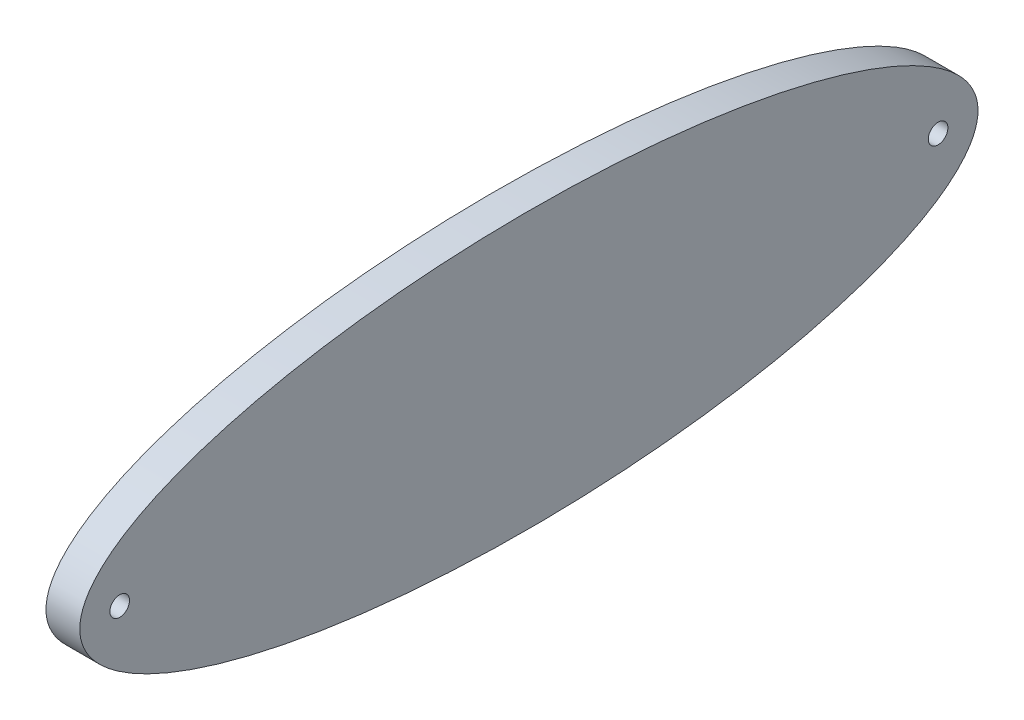
ISO-10303-21;
HEADER;
FILE_DESCRIPTION(('STEP AP214'),'2;1');
FILE_NAME('part.step','',(''),(''),'','','');
FILE_SCHEMA(('AUTOMOTIVE_DESIGN { 1 0 10303 214 1 1 1 1 }'));
ENDSEC;
DATA;
#1=APPLICATION_CONTEXT('core data for automotive mechanical design processes');
#2=APPLICATION_PROTOCOL_DEFINITION('international standard','automotive_design',2000,#1);
#3=PRODUCT_CONTEXT('',#1,'mechanical');
#4=PRODUCT('Part','Part','',(#3));
#5=PRODUCT_RELATED_PRODUCT_CATEGORY('part','',(#4));
#6=PRODUCT_DEFINITION_FORMATION('','',#4);
#7=PRODUCT_DEFINITION_CONTEXT('part definition',#1,'design');
#8=PRODUCT_DEFINITION('design','',#6,#7);
#9=PRODUCT_DEFINITION_SHAPE('','',#8);
#10=(LENGTH_UNIT() NAMED_UNIT(*) SI_UNIT(.MILLI.,.METRE.));
#11=(NAMED_UNIT(*) PLANE_ANGLE_UNIT() SI_UNIT($,.RADIAN.));
#12=(NAMED_UNIT(*) SI_UNIT($,.STERADIAN.) SOLID_ANGLE_UNIT());
#13=UNCERTAINTY_MEASURE_WITH_UNIT(LENGTH_MEASURE(1.E-05),#10,'distance_accuracy_value','');
#14=(GEOMETRIC_REPRESENTATION_CONTEXT(3) GLOBAL_UNCERTAINTY_ASSIGNED_CONTEXT((#13)) GLOBAL_UNIT_ASSIGNED_CONTEXT((#10,
#11,#12)) REPRESENTATION_CONTEXT('',''));
#15=CARTESIAN_POINT('',(0.,0.,0.));
#16=DIRECTION('',(0.,0.,1.));
#17=DIRECTION('',(1.,0.,0.));
#18=AXIS2_PLACEMENT_3D('',#15,#16,#17);
#19=CARTESIAN_POINT('',(5.08,0.,0.));
#20=DIRECTION('',(1.,0.,0.));
#21=DIRECTION('',(0.,0.,-1.));
#22=AXIS2_PLACEMENT_3D('',#19,#20,#21);
#23=PLANE('',#22);
#24=CARTESIAN_POINT('',(5.08,0.,61.5));
#25=DIRECTION('',(1.,0.,0.));
#26=DIRECTION('',(0.,0.,-1.));
#27=AXIS2_PLACEMENT_3D('',#24,#25,#26);
#28=CIRCLE('',#27,1.4732);
#29=CARTESIAN_POINT('',(5.08,0.,60.0268));
#30=VERTEX_POINT('',#29);
#31=EDGE_CURVE('E42',#30,#30,#28,.T.);
#32=ORIENTED_EDGE('',*,*,#31,.F.);
#33=EDGE_LOOP('',(#32));
#34=FACE_BOUND('',#33,.T.);
#35=CARTESIAN_POINT('',(5.08,0.,0.));
#36=DIRECTION('',(1.,0.,0.));
#37=DIRECTION('',(0.,0.,-1.));
#38=AXIS2_PLACEMENT_3D('',#35,#36,#37);
#39=ELLIPSE('',#38,67.5,20.7);
#40=CARTESIAN_POINT('',(5.08,0.,-67.5));
#41=VERTEX_POINT('',#40);
#42=EDGE_CURVE('E10',#41,#41,#39,.T.);
#43=ORIENTED_EDGE('',*,*,#42,.T.);
#44=EDGE_LOOP('',(#43));
#45=FACE_BOUND('',#44,.T.);
#46=CARTESIAN_POINT('',(5.08,0.,-61.5));
#47=DIRECTION('',(1.,0.,0.));
#48=DIRECTION('',(0.,0.,-1.));
#49=AXIS2_PLACEMENT_3D('',#46,#47,#48);
#50=CIRCLE('',#49,1.47320000000001);
#51=CARTESIAN_POINT('',(5.08,0.,-62.9732));
#52=VERTEX_POINT('',#51);
#53=EDGE_CURVE('E48',#52,#52,#50,.T.);
#54=ORIENTED_EDGE('',*,*,#53,.F.);
#55=EDGE_LOOP('',(#54));
#56=FACE_BOUND('',#55,.T.);
#57=ADVANCED_FACE('F31',(#34,#45,#56),#23,.T.);
#58=CARTESIAN_POINT('',(0.,0.,0.));
#59=DIRECTION('',(1.,0.,0.));
#60=DIRECTION('',(0.,0.,-1.));
#61=AXIS2_PLACEMENT_3D('',#58,#59,#60);
#62=PLANE('',#61);
#63=CARTESIAN_POINT('',(0.,0.,0.));
#64=DIRECTION('',(1.,0.,0.));
#65=DIRECTION('',(0.,0.,-1.));
#66=AXIS2_PLACEMENT_3D('',#63,#64,#65);
#67=ELLIPSE('',#66,67.5,20.7);
#68=CARTESIAN_POINT('',(0.,0.,-67.5));
#69=VERTEX_POINT('',#68);
#70=EDGE_CURVE('E36',#69,#69,#67,.T.);
#71=ORIENTED_EDGE('',*,*,#70,.F.);
#72=EDGE_LOOP('',(#71));
#73=FACE_BOUND('',#72,.T.);
#74=CARTESIAN_POINT('',(0.,0.,61.5));
#75=DIRECTION('',(1.,0.,0.));
#76=DIRECTION('',(0.,0.,-1.));
#77=AXIS2_PLACEMENT_3D('',#74,#75,#76);
#78=CIRCLE('',#77,1.4732);
#79=CARTESIAN_POINT('',(0.,0.,60.0268));
#80=VERTEX_POINT('',#79);
#81=EDGE_CURVE('E45',#80,#80,#78,.T.);
#82=ORIENTED_EDGE('',*,*,#81,.T.);
#83=EDGE_LOOP('',(#82));
#84=FACE_BOUND('',#83,.T.);
#85=CARTESIAN_POINT('',(0.,0.,-61.5));
#86=DIRECTION('',(1.,0.,0.));
#87=DIRECTION('',(0.,0.,-1.));
#88=AXIS2_PLACEMENT_3D('',#85,#86,#87);
#89=CIRCLE('',#88,1.47320000000001);
#90=CARTESIAN_POINT('',(0.,0.,-62.9732));
#91=VERTEX_POINT('',#90);
#92=EDGE_CURVE('E51',#91,#91,#89,.T.);
#93=ORIENTED_EDGE('',*,*,#92,.T.);
#94=EDGE_LOOP('',(#93));
#95=FACE_BOUND('',#94,.T.);
#96=ADVANCED_FACE('F61',(#73,#84,#95),#62,.F.);
#97=DIRECTION('',(-1.,0.,0.));
#98=VECTOR('',#97,1.);
#99=SURFACE_OF_LINEAR_EXTRUSION('',#39,#98);
#100=ORIENTED_EDGE('',*,*,#42,.F.);
#101=EDGE_LOOP('',(#100));
#102=FACE_BOUND('',#101,.T.);
#103=ORIENTED_EDGE('',*,*,#70,.T.);
#104=EDGE_LOOP('',(#103));
#105=FACE_BOUND('',#104,.T.);
#106=ADVANCED_FACE('F33',(#102,#105),#99,.F.);
#107=CARTESIAN_POINT('',(5.08,0.,61.5));
#108=DIRECTION('',(-1.,0.,0.));
#109=DIRECTION('',(0.,0.,1.));
#110=AXIS2_PLACEMENT_3D('',#107,#108,#109);
#111=CYLINDRICAL_SURFACE('',#110,1.4732);
#112=ORIENTED_EDGE('',*,*,#31,.T.);
#113=EDGE_LOOP('',(#112));
#114=FACE_BOUND('',#113,.T.);
#115=ORIENTED_EDGE('',*,*,#81,.F.);
#116=EDGE_LOOP('',(#115));
#117=FACE_BOUND('',#116,.T.);
#118=ADVANCED_FACE('F70',(#114,#117),#111,.F.);
#119=CARTESIAN_POINT('',(5.08,0.,-61.5));
#120=DIRECTION('',(-1.,0.,0.));
#121=DIRECTION('',(0.,0.,1.));
#122=AXIS2_PLACEMENT_3D('',#119,#120,#121);
#123=CYLINDRICAL_SURFACE('',#122,1.47320000000001);
#124=ORIENTED_EDGE('',*,*,#53,.T.);
#125=EDGE_LOOP('',(#124));
#126=FACE_BOUND('',#125,.T.);
#127=ORIENTED_EDGE('',*,*,#92,.F.);
#128=EDGE_LOOP('',(#127));
#129=FACE_BOUND('',#128,.T.);
#130=ADVANCED_FACE('F57',(#126,#129),#123,.F.);
#131=CLOSED_SHELL('',(#57,#96,#106,#118,#130));
#132=MANIFOLD_SOLID_BREP('B2',#131);
#133=ADVANCED_BREP_SHAPE_REPRESENTATION('',(#18,#132),#14);
#134=SHAPE_DEFINITION_REPRESENTATION(#9,#133);
ENDSEC;
END-ISO-10303-21;
